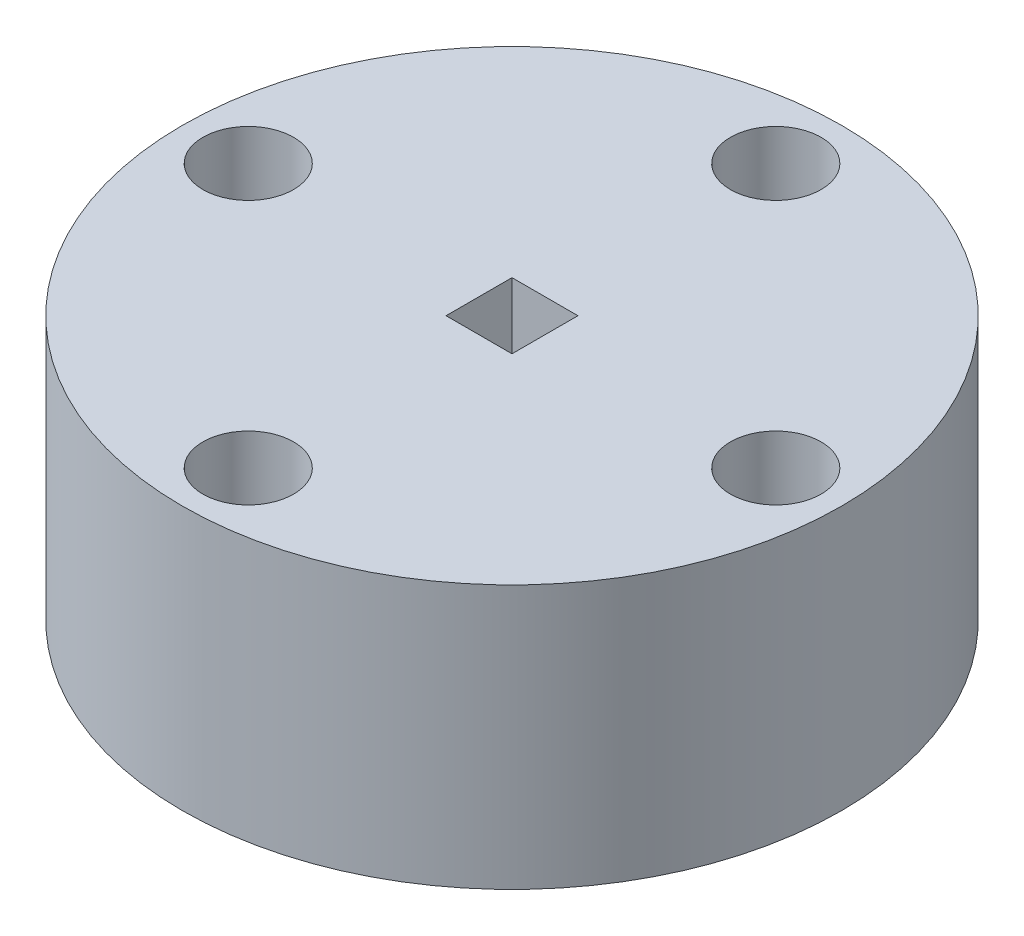
ISO-10303-21;
HEADER;
FILE_DESCRIPTION(('STEP AP214'),'2;1');
FILE_NAME('part.step','',(''),(''),'','','');
FILE_SCHEMA(('AUTOMOTIVE_DESIGN { 1 0 10303 214 1 1 1 1 }'));
ENDSEC;
DATA;
#1=APPLICATION_CONTEXT('core data for automotive mechanical design processes');
#2=APPLICATION_PROTOCOL_DEFINITION('international standard','automotive_design',2000,#1);
#3=PRODUCT_CONTEXT('',#1,'mechanical');
#4=PRODUCT('Part','Part','',(#3));
#5=PRODUCT_RELATED_PRODUCT_CATEGORY('part','',(#4));
#6=PRODUCT_DEFINITION_FORMATION('','',#4);
#7=PRODUCT_DEFINITION_CONTEXT('part definition',#1,'design');
#8=PRODUCT_DEFINITION('design','',#6,#7);
#9=PRODUCT_DEFINITION_SHAPE('','',#8);
#10=(LENGTH_UNIT() NAMED_UNIT(*) SI_UNIT(.MILLI.,.METRE.));
#11=(NAMED_UNIT(*) PLANE_ANGLE_UNIT() SI_UNIT($,.RADIAN.));
#12=(NAMED_UNIT(*) SI_UNIT($,.STERADIAN.) SOLID_ANGLE_UNIT());
#13=UNCERTAINTY_MEASURE_WITH_UNIT(LENGTH_MEASURE(1.E-05),#10,'distance_accuracy_value','');
#14=(GEOMETRIC_REPRESENTATION_CONTEXT(3) GLOBAL_UNCERTAINTY_ASSIGNED_CONTEXT((#13)) GLOBAL_UNIT_ASSIGNED_CONTEXT((#10,
#11,#12)) REPRESENTATION_CONTEXT('',''));
#15=CARTESIAN_POINT('',(0.,0.,0.));
#16=DIRECTION('',(0.,0.,1.));
#17=DIRECTION('',(1.,0.,0.));
#18=AXIS2_PLACEMENT_3D('',#15,#16,#17);
#19=CARTESIAN_POINT('',(0.,12.7,0.));
#20=DIRECTION('',(0.,1.,0.));
#21=DIRECTION('',(0.,0.,1.));
#22=AXIS2_PLACEMENT_3D('',#19,#20,#21);
#23=PLANE('',#22);
#24=CARTESIAN_POINT('',(0.,12.7,-12.7));
#25=DIRECTION('',(0.,1.,0.));
#26=DIRECTION('',(0.,0.,1.));
#27=AXIS2_PLACEMENT_3D('',#24,#25,#26);
#28=CIRCLE('',#27,2.1828125);
#29=CARTESIAN_POINT('',(0.,12.7,-10.5171875));
#30=VERTEX_POINT('',#29);
#31=EDGE_CURVE('E227',#30,#30,#28,.T.);
#32=ORIENTED_EDGE('',*,*,#31,.F.);
#33=EDGE_LOOP('',(#32));
#34=FACE_BOUND('',#33,.T.);
#35=CARTESIAN_POINT('',(12.7,12.7,0.));
#36=DIRECTION('',(0.,1.,0.));
#37=DIRECTION('',(0.,0.,1.));
#38=AXIS2_PLACEMENT_3D('',#35,#36,#37);
#39=CIRCLE('',#38,2.1828125);
#40=CARTESIAN_POINT('',(12.7,12.7,2.1828125));
#41=VERTEX_POINT('',#40);
#42=EDGE_CURVE('E115',#41,#41,#39,.T.);
#43=ORIENTED_EDGE('',*,*,#42,.F.);
#44=EDGE_LOOP('',(#43));
#45=FACE_BOUND('',#44,.T.);
#46=CARTESIAN_POINT('',(0.,12.7,0.));
#47=DIRECTION('',(0.,1.,0.));
#48=DIRECTION('',(0.,0.,1.));
#49=AXIS2_PLACEMENT_3D('',#46,#47,#48);
#50=CIRCLE('',#49,15.875);
#51=CARTESIAN_POINT('',(0.,12.7,15.875));
#52=VERTEX_POINT('',#51);
#53=EDGE_CURVE('E11',#52,#52,#50,.T.);
#54=ORIENTED_EDGE('',*,*,#53,.T.);
#55=EDGE_LOOP('',(#54));
#56=FACE_BOUND('',#55,.T.);
#57=DIRECTION('',(-1.,0.,0.));
#58=VECTOR('',#57,1.);
#59=CARTESIAN_POINT('',(-1.5875,12.7,-1.5875));
#60=LINE('',#59,#58);
#61=CARTESIAN_POINT('',(1.5875,12.7,-1.5875));
#62=VERTEX_POINT('',#61);
#63=CARTESIAN_POINT('',(-1.5875,12.7,-1.5875));
#64=VERTEX_POINT('',#63);
#65=EDGE_CURVE('E90',#62,#64,#60,.T.);
#66=ORIENTED_EDGE('',*,*,#65,.F.);
#67=DIRECTION('',(0.,0.,-1.));
#68=VECTOR('',#67,1.);
#69=CARTESIAN_POINT('',(1.5875,12.7,1.5875));
#70=LINE('',#69,#68);
#71=CARTESIAN_POINT('',(1.5875,12.7,1.5875));
#72=VERTEX_POINT('',#71);
#73=EDGE_CURVE('E81',#72,#62,#70,.T.);
#74=ORIENTED_EDGE('',*,*,#73,.F.);
#75=DIRECTION('',(1.,0.,0.));
#76=VECTOR('',#75,1.);
#77=CARTESIAN_POINT('',(-1.5875,12.7,1.5875));
#78=LINE('',#77,#76);
#79=CARTESIAN_POINT('',(-1.5875,12.7,1.5875));
#80=VERTEX_POINT('',#79);
#81=EDGE_CURVE('E107',#80,#72,#78,.T.);
#82=ORIENTED_EDGE('',*,*,#81,.F.);
#83=DIRECTION('',(0.,0.,1.));
#84=VECTOR('',#83,1.);
#85=CARTESIAN_POINT('',(-1.5875,12.7,1.5875));
#86=LINE('',#85,#84);
#87=EDGE_CURVE('E103',#64,#80,#86,.T.);
#88=ORIENTED_EDGE('',*,*,#87,.F.);
#89=EDGE_LOOP('',(#66,#74,#82,#88));
#90=FACE_BOUND('',#89,.T.);
#91=CARTESIAN_POINT('',(-12.7,12.7,0.));
#92=DIRECTION('',(0.,1.,0.));
#93=DIRECTION('',(0.,0.,1.));
#94=AXIS2_PLACEMENT_3D('',#91,#92,#93);
#95=CIRCLE('',#94,2.1828125);
#96=CARTESIAN_POINT('',(-12.7,12.7,2.1828125));
#97=VERTEX_POINT('',#96);
#98=EDGE_CURVE('E235',#97,#97,#95,.T.);
#99=ORIENTED_EDGE('',*,*,#98,.F.);
#100=EDGE_LOOP('',(#99));
#101=FACE_BOUND('',#100,.T.);
#102=CARTESIAN_POINT('',(0.,12.7,12.7));
#103=DIRECTION('',(0.,1.,0.));
#104=DIRECTION('',(0.,0.,1.));
#105=AXIS2_PLACEMENT_3D('',#102,#103,#104);
#106=CIRCLE('',#105,2.1828125);
#107=CARTESIAN_POINT('',(0.,12.7,14.8828125));
#108=VERTEX_POINT('',#107);
#109=EDGE_CURVE('E216',#108,#108,#106,.T.);
#110=ORIENTED_EDGE('',*,*,#109,.F.);
#111=EDGE_LOOP('',(#110));
#112=FACE_BOUND('',#111,.T.);
#113=ADVANCED_FACE('F39',(#34,#45,#56,#90,#101,#112),#23,.T.);
#114=CARTESIAN_POINT('',(0.,0.,0.));
#115=DIRECTION('',(0.,1.,0.));
#116=DIRECTION('',(0.,0.,1.));
#117=AXIS2_PLACEMENT_3D('',#114,#115,#116);
#118=PLANE('',#117);
#119=CARTESIAN_POINT('',(0.,0.,0.));
#120=DIRECTION('',(0.,1.,0.));
#121=DIRECTION('',(0.,0.,1.));
#122=AXIS2_PLACEMENT_3D('',#119,#120,#121);
#123=CIRCLE('',#122,15.875);
#124=CARTESIAN_POINT('',(0.,0.,15.875));
#125=VERTEX_POINT('',#124);
#126=EDGE_CURVE('E43',#125,#125,#123,.T.);
#127=ORIENTED_EDGE('',*,*,#126,.F.);
#128=EDGE_LOOP('',(#127));
#129=FACE_BOUND('',#128,.T.);
#130=DIRECTION('',(0.,0.,-1.));
#131=VECTOR('',#130,1.);
#132=CARTESIAN_POINT('',(1.5875,0.,1.5875));
#133=LINE('',#132,#131);
#134=CARTESIAN_POINT('',(1.5875,0.,1.5875));
#135=VERTEX_POINT('',#134);
#136=CARTESIAN_POINT('',(1.5875,0.,-1.5875));
#137=VERTEX_POINT('',#136);
#138=EDGE_CURVE('E63',#135,#137,#133,.T.);
#139=ORIENTED_EDGE('',*,*,#138,.T.);
#140=DIRECTION('',(-1.,0.,0.));
#141=VECTOR('',#140,1.);
#142=CARTESIAN_POINT('',(-1.5875,0.,-1.5875));
#143=LINE('',#142,#141);
#144=CARTESIAN_POINT('',(-1.5875,0.,-1.5875));
#145=VERTEX_POINT('',#144);
#146=EDGE_CURVE('E97',#137,#145,#143,.T.);
#147=ORIENTED_EDGE('',*,*,#146,.T.);
#148=DIRECTION('',(0.,0.,1.));
#149=VECTOR('',#148,1.);
#150=CARTESIAN_POINT('',(-1.5875,0.,1.5875));
#151=LINE('',#150,#149);
#152=CARTESIAN_POINT('',(-1.5875,0.,1.5875));
#153=VERTEX_POINT('',#152);
#154=EDGE_CURVE('E118',#145,#153,#151,.T.);
#155=ORIENTED_EDGE('',*,*,#154,.T.);
#156=DIRECTION('',(1.,0.,0.));
#157=VECTOR('',#156,1.);
#158=CARTESIAN_POINT('',(-1.5875,0.,1.5875));
#159=LINE('',#158,#157);
#160=EDGE_CURVE('E91',#153,#135,#159,.T.);
#161=ORIENTED_EDGE('',*,*,#160,.T.);
#162=EDGE_LOOP('',(#139,#147,#155,#161));
#163=FACE_BOUND('',#162,.T.);
#164=CARTESIAN_POINT('',(12.7,0.,0.));
#165=DIRECTION('',(0.,1.,0.));
#166=DIRECTION('',(0.,0.,1.));
#167=AXIS2_PLACEMENT_3D('',#164,#165,#166);
#168=CIRCLE('',#167,2.1828125);
#169=CARTESIAN_POINT('',(12.7,0.,2.1828125));
#170=VERTEX_POINT('',#169);
#171=EDGE_CURVE('E239',#170,#170,#168,.T.);
#172=ORIENTED_EDGE('',*,*,#171,.T.);
#173=EDGE_LOOP('',(#172));
#174=FACE_BOUND('',#173,.T.);
#175=CARTESIAN_POINT('',(-12.7,0.,0.));
#176=DIRECTION('',(0.,1.,0.));
#177=DIRECTION('',(0.,0.,1.));
#178=AXIS2_PLACEMENT_3D('',#175,#176,#177);
#179=CIRCLE('',#178,2.1828125);
#180=CARTESIAN_POINT('',(-12.7,0.,2.1828125));
#181=VERTEX_POINT('',#180);
#182=EDGE_CURVE('E231',#181,#181,#179,.T.);
#183=ORIENTED_EDGE('',*,*,#182,.T.);
#184=EDGE_LOOP('',(#183));
#185=FACE_BOUND('',#184,.T.);
#186=CARTESIAN_POINT('',(0.,0.,-12.7));
#187=DIRECTION('',(0.,1.,0.));
#188=DIRECTION('',(0.,0.,1.));
#189=AXIS2_PLACEMENT_3D('',#186,#187,#188);
#190=CIRCLE('',#189,2.1828125);
#191=CARTESIAN_POINT('',(0.,0.,-10.5171875));
#192=VERTEX_POINT('',#191);
#193=EDGE_CURVE('E224',#192,#192,#190,.T.);
#194=ORIENTED_EDGE('',*,*,#193,.T.);
#195=EDGE_LOOP('',(#194));
#196=FACE_BOUND('',#195,.T.);
#197=CARTESIAN_POINT('',(0.,0.,12.7));
#198=DIRECTION('',(0.,1.,0.));
#199=DIRECTION('',(0.,0.,1.));
#200=AXIS2_PLACEMENT_3D('',#197,#198,#199);
#201=CIRCLE('',#200,2.1828125);
#202=CARTESIAN_POINT('',(0.,0.,14.8828125));
#203=VERTEX_POINT('',#202);
#204=EDGE_CURVE('E219',#203,#203,#201,.T.);
#205=ORIENTED_EDGE('',*,*,#204,.T.);
#206=EDGE_LOOP('',(#205));
#207=FACE_BOUND('',#206,.T.);
#208=ADVANCED_FACE('F134',(#129,#163,#174,#185,#196,#207),#118,.F.);
#209=CARTESIAN_POINT('',(0.,12.7,0.));
#210=DIRECTION('',(0.,-1.,0.));
#211=DIRECTION('',(0.,0.,-1.));
#212=AXIS2_PLACEMENT_3D('',#209,#210,#211);
#213=CYLINDRICAL_SURFACE('',#212,15.875);
#214=ORIENTED_EDGE('',*,*,#53,.F.);
#215=EDGE_LOOP('',(#214));
#216=FACE_BOUND('',#215,.T.);
#217=ORIENTED_EDGE('',*,*,#126,.T.);
#218=EDGE_LOOP('',(#217));
#219=FACE_BOUND('',#218,.T.);
#220=ADVANCED_FACE('F41',(#216,#219),#213,.T.);
#221=CARTESIAN_POINT('',(1.5875,12.7,1.5875));
#222=DIRECTION('',(-1.,0.,0.));
#223=DIRECTION('',(0.,0.,1.));
#224=AXIS2_PLACEMENT_3D('',#221,#222,#223);
#225=PLANE('',#224);
#226=ORIENTED_EDGE('',*,*,#138,.F.);
#227=DIRECTION('',(0.,-1.,0.));
#228=VECTOR('',#227,1.);
#229=CARTESIAN_POINT('',(1.5875,12.7,1.5875));
#230=LINE('',#229,#228);
#231=EDGE_CURVE('E85',#72,#135,#230,.T.);
#232=ORIENTED_EDGE('',*,*,#231,.F.);
#233=ORIENTED_EDGE('',*,*,#73,.T.);
#234=DIRECTION('',(0.,-1.,0.));
#235=VECTOR('',#234,1.);
#236=CARTESIAN_POINT('',(1.5875,12.7,-1.5875));
#237=LINE('',#236,#235);
#238=EDGE_CURVE('E84',#62,#137,#237,.T.);
#239=ORIENTED_EDGE('',*,*,#238,.T.);
#240=EDGE_LOOP('',(#226,#232,#233,#239));
#241=FACE_BOUND('',#240,.T.);
#242=ADVANCED_FACE('F83',(#241),#225,.T.);
#243=CARTESIAN_POINT('',(-1.5875,12.7,-1.5875));
#244=DIRECTION('',(0.,0.,1.));
#245=DIRECTION('',(1.,0.,0.));
#246=AXIS2_PLACEMENT_3D('',#243,#244,#245);
#247=PLANE('',#246);
#248=ORIENTED_EDGE('',*,*,#146,.F.);
#249=ORIENTED_EDGE('',*,*,#238,.F.);
#250=ORIENTED_EDGE('',*,*,#65,.T.);
#251=DIRECTION('',(0.,-1.,0.));
#252=VECTOR('',#251,1.);
#253=CARTESIAN_POINT('',(-1.5875,12.7,-1.5875));
#254=LINE('',#253,#252);
#255=EDGE_CURVE('E99',#64,#145,#254,.T.);
#256=ORIENTED_EDGE('',*,*,#255,.T.);
#257=EDGE_LOOP('',(#248,#249,#250,#256));
#258=FACE_BOUND('',#257,.T.);
#259=ADVANCED_FACE('F94',(#258),#247,.T.);
#260=CARTESIAN_POINT('',(-1.5875,12.7,1.5875));
#261=DIRECTION('',(1.,0.,0.));
#262=DIRECTION('',(0.,0.,-1.));
#263=AXIS2_PLACEMENT_3D('',#260,#261,#262);
#264=PLANE('',#263);
#265=ORIENTED_EDGE('',*,*,#154,.F.);
#266=ORIENTED_EDGE('',*,*,#255,.F.);
#267=ORIENTED_EDGE('',*,*,#87,.T.);
#268=DIRECTION('',(0.,-1.,0.));
#269=VECTOR('',#268,1.);
#270=CARTESIAN_POINT('',(-1.5875,12.7,1.5875));
#271=LINE('',#270,#269);
#272=EDGE_CURVE('E55',#80,#153,#271,.T.);
#273=ORIENTED_EDGE('',*,*,#272,.T.);
#274=EDGE_LOOP('',(#265,#266,#267,#273));
#275=FACE_BOUND('',#274,.T.);
#276=ADVANCED_FACE('F132',(#275),#264,.T.);
#277=CARTESIAN_POINT('',(-1.5875,12.7,1.5875));
#278=DIRECTION('',(0.,0.,-1.));
#279=DIRECTION('',(-1.,0.,0.));
#280=AXIS2_PLACEMENT_3D('',#277,#278,#279);
#281=PLANE('',#280);
#282=ORIENTED_EDGE('',*,*,#160,.F.);
#283=ORIENTED_EDGE('',*,*,#272,.F.);
#284=ORIENTED_EDGE('',*,*,#81,.T.);
#285=ORIENTED_EDGE('',*,*,#231,.T.);
#286=EDGE_LOOP('',(#282,#283,#284,#285));
#287=FACE_BOUND('',#286,.T.);
#288=ADVANCED_FACE('F136',(#287),#281,.T.);
#289=CARTESIAN_POINT('',(12.7,12.7,0.));
#290=DIRECTION('',(0.,-1.,0.));
#291=DIRECTION('',(0.,0.,-1.));
#292=AXIS2_PLACEMENT_3D('',#289,#290,#291);
#293=CYLINDRICAL_SURFACE('',#292,2.1828125);
#294=ORIENTED_EDGE('',*,*,#42,.T.);
#295=EDGE_LOOP('',(#294));
#296=FACE_BOUND('',#295,.T.);
#297=ORIENTED_EDGE('',*,*,#171,.F.);
#298=EDGE_LOOP('',(#297));
#299=FACE_BOUND('',#298,.T.);
#300=ADVANCED_FACE('F138',(#296,#299),#293,.F.);
#301=CARTESIAN_POINT('',(-12.7,12.7,0.));
#302=DIRECTION('',(0.,-1.,0.));
#303=DIRECTION('',(0.,0.,-1.));
#304=AXIS2_PLACEMENT_3D('',#301,#302,#303);
#305=CYLINDRICAL_SURFACE('',#304,2.1828125);
#306=ORIENTED_EDGE('',*,*,#98,.T.);
#307=EDGE_LOOP('',(#306));
#308=FACE_BOUND('',#307,.T.);
#309=ORIENTED_EDGE('',*,*,#182,.F.);
#310=EDGE_LOOP('',(#309));
#311=FACE_BOUND('',#310,.T.);
#312=ADVANCED_FACE('F144',(#308,#311),#305,.F.);
#313=CARTESIAN_POINT('',(0.,12.7,-12.7));
#314=DIRECTION('',(0.,-1.,0.));
#315=DIRECTION('',(0.,0.,-1.));
#316=AXIS2_PLACEMENT_3D('',#313,#314,#315);
#317=CYLINDRICAL_SURFACE('',#316,2.1828125);
#318=ORIENTED_EDGE('',*,*,#31,.T.);
#319=EDGE_LOOP('',(#318));
#320=FACE_BOUND('',#319,.T.);
#321=ORIENTED_EDGE('',*,*,#193,.F.);
#322=EDGE_LOOP('',(#321));
#323=FACE_BOUND('',#322,.T.);
#324=ADVANCED_FACE('F189',(#320,#323),#317,.F.);
#325=CARTESIAN_POINT('',(0.,12.7,12.7));
#326=DIRECTION('',(0.,-1.,0.));
#327=DIRECTION('',(0.,0.,-1.));
#328=AXIS2_PLACEMENT_3D('',#325,#326,#327);
#329=CYLINDRICAL_SURFACE('',#328,2.1828125);
#330=ORIENTED_EDGE('',*,*,#109,.T.);
#331=EDGE_LOOP('',(#330));
#332=FACE_BOUND('',#331,.T.);
#333=ORIENTED_EDGE('',*,*,#204,.F.);
#334=EDGE_LOOP('',(#333));
#335=FACE_BOUND('',#334,.T.);
#336=ADVANCED_FACE('F199',(#332,#335),#329,.F.);
#337=CLOSED_SHELL('',(#113,#208,#220,#242,#259,#276,#288,#300,#312,#324,#336));
#338=MANIFOLD_SOLID_BREP('B2',#337);
#339=ADVANCED_BREP_SHAPE_REPRESENTATION('',(#18,#338),#14);
#340=SHAPE_DEFINITION_REPRESENTATION(#9,#339);
ENDSEC;
END-ISO-10303-21;
